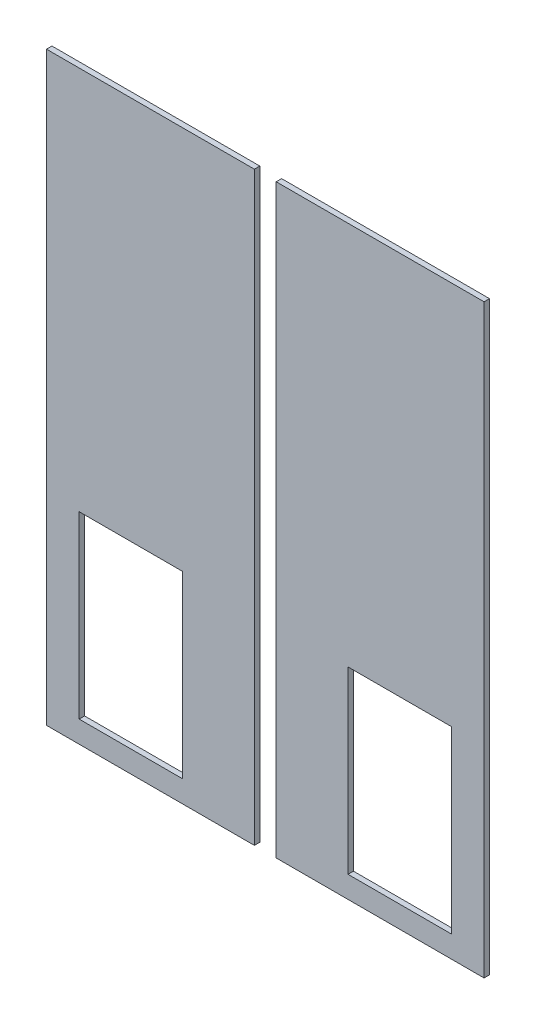
ISO-10303-21;
HEADER;
FILE_DESCRIPTION(('STEP AP214'),'2;1');
FILE_NAME('part.step','',(''),(''),'','','');
FILE_SCHEMA(('AUTOMOTIVE_DESIGN { 1 0 10303 214 1 1 1 1 }'));
ENDSEC;
DATA;
#1=APPLICATION_CONTEXT('core data for automotive mechanical design processes');
#2=APPLICATION_PROTOCOL_DEFINITION('international standard','automotive_design',2000,#1);
#3=PRODUCT_CONTEXT('',#1,'mechanical');
#4=PRODUCT('Part','Part','',(#3));
#5=PRODUCT_RELATED_PRODUCT_CATEGORY('part','',(#4));
#6=PRODUCT_DEFINITION_FORMATION('','',#4);
#7=PRODUCT_DEFINITION_CONTEXT('part definition',#1,'design');
#8=PRODUCT_DEFINITION('design','',#6,#7);
#9=PRODUCT_DEFINITION_SHAPE('','',#8);
#10=(LENGTH_UNIT() NAMED_UNIT(*) SI_UNIT(.MILLI.,.METRE.));
#11=(NAMED_UNIT(*) PLANE_ANGLE_UNIT() SI_UNIT($,.RADIAN.));
#12=(NAMED_UNIT(*) SI_UNIT($,.STERADIAN.) SOLID_ANGLE_UNIT());
#13=UNCERTAINTY_MEASURE_WITH_UNIT(LENGTH_MEASURE(1.E-05),#10,'distance_accuracy_value','');
#14=(GEOMETRIC_REPRESENTATION_CONTEXT(3) GLOBAL_UNCERTAINTY_ASSIGNED_CONTEXT((#13)) GLOBAL_UNIT_ASSIGNED_CONTEXT((#10,
#11,#12)) REPRESENTATION_CONTEXT('',''));
#15=CARTESIAN_POINT('',(0.,0.,0.));
#16=DIRECTION('',(0.,0.,1.));
#17=DIRECTION('',(1.,0.,0.));
#18=AXIS2_PLACEMENT_3D('',#15,#16,#17);
#19=CARTESIAN_POINT('',(0.,341.63,6.35));
#20=DIRECTION('',(0.,1.,0.));
#21=DIRECTION('',(0.,0.,1.));
#22=AXIS2_PLACEMENT_3D('',#19,#20,#21);
#23=PLANE('',#22);
#24=DIRECTION('',(1.,0.,0.));
#25=VECTOR('',#24,1.);
#26=CARTESIAN_POINT('',(0.,341.63,0.));
#27=LINE('',#26,#25);
#28=CARTESIAN_POINT('',(12.7,341.63,0.));
#29=VERTEX_POINT('',#28);
#30=CARTESIAN_POINT('',(255.27,341.63,0.));
#31=VERTEX_POINT('',#30);
#32=EDGE_CURVE('E172',#29,#31,#27,.T.);
#33=ORIENTED_EDGE('',*,*,#32,.F.);
#34=DIRECTION('',(0.,0.,-1.));
#35=VECTOR('',#34,1.);
#36=CARTESIAN_POINT('',(12.7,341.63,6.35));
#37=LINE('',#36,#35);
#38=CARTESIAN_POINT('',(12.7,341.63,6.35));
#39=VERTEX_POINT('',#38);
#40=EDGE_CURVE('E12',#39,#29,#37,.T.);
#41=ORIENTED_EDGE('',*,*,#40,.F.);
#42=DIRECTION('',(1.,0.,0.));
#43=VECTOR('',#42,1.);
#44=CARTESIAN_POINT('',(0.,341.63,6.35));
#45=LINE('',#44,#43);
#46=CARTESIAN_POINT('',(255.27,341.63,6.35));
#47=VERTEX_POINT('',#46);
#48=EDGE_CURVE('E142',#39,#47,#45,.T.);
#49=ORIENTED_EDGE('',*,*,#48,.T.);
#50=DIRECTION('',(0.,0.,-1.));
#51=VECTOR('',#50,1.);
#52=CARTESIAN_POINT('',(255.27,341.63,6.35));
#53=LINE('',#52,#51);
#54=EDGE_CURVE('E76',#47,#31,#53,.T.);
#55=ORIENTED_EDGE('',*,*,#54,.T.);
#56=EDGE_LOOP('',(#33,#41,#49,#55));
#57=FACE_BOUND('',#56,.T.);
#58=ADVANCED_FACE('F57',(#57),#23,.T.);
#59=CARTESIAN_POINT('',(12.7,0.,6.35));
#60=DIRECTION('',(1.,0.,0.));
#61=DIRECTION('',(0.,1.,0.));
#62=AXIS2_PLACEMENT_3D('',#59,#60,#61);
#63=PLANE('',#62);
#64=DIRECTION('',(0.,-1.,0.));
#65=VECTOR('',#64,1.);
#66=CARTESIAN_POINT('',(12.7,0.,0.));
#67=LINE('',#66,#65);
#68=CARTESIAN_POINT('',(12.7,-341.63,0.));
#69=VERTEX_POINT('',#68);
#70=EDGE_CURVE('E147',#29,#69,#67,.T.);
#71=ORIENTED_EDGE('',*,*,#70,.T.);
#72=DIRECTION('',(0.,0.,-1.));
#73=VECTOR('',#72,1.);
#74=CARTESIAN_POINT('',(12.7,-341.63,6.35));
#75=LINE('',#74,#73);
#76=CARTESIAN_POINT('',(12.7,-341.63,6.35));
#77=VERTEX_POINT('',#76);
#78=EDGE_CURVE('E67',#77,#69,#75,.T.);
#79=ORIENTED_EDGE('',*,*,#78,.F.);
#80=DIRECTION('',(0.,-1.,0.));
#81=VECTOR('',#80,1.);
#82=CARTESIAN_POINT('',(12.7,0.,6.35));
#83=LINE('',#82,#81);
#84=EDGE_CURVE('E137',#39,#77,#83,.T.);
#85=ORIENTED_EDGE('',*,*,#84,.F.);
#86=ORIENTED_EDGE('',*,*,#40,.T.);
#87=EDGE_LOOP('',(#71,#79,#85,#86));
#88=FACE_BOUND('',#87,.T.);
#89=ADVANCED_FACE('F145',(#88),#63,.F.);
#90=CARTESIAN_POINT('',(0.,-341.63,6.35));
#91=DIRECTION('',(0.,1.,0.));
#92=DIRECTION('',(0.,0.,1.));
#93=AXIS2_PLACEMENT_3D('',#90,#91,#92);
#94=PLANE('',#93);
#95=DIRECTION('',(1.,0.,0.));
#96=VECTOR('',#95,1.);
#97=CARTESIAN_POINT('',(0.,-341.63,0.));
#98=LINE('',#97,#96);
#99=CARTESIAN_POINT('',(255.27,-341.63,0.));
#100=VERTEX_POINT('',#99);
#101=EDGE_CURVE('E169',#69,#100,#98,.T.);
#102=ORIENTED_EDGE('',*,*,#101,.T.);
#103=DIRECTION('',(0.,0.,-1.));
#104=VECTOR('',#103,1.);
#105=CARTESIAN_POINT('',(255.27,-341.63,6.35));
#106=LINE('',#105,#104);
#107=CARTESIAN_POINT('',(255.27,-341.63,6.35));
#108=VERTEX_POINT('',#107);
#109=EDGE_CURVE('E102',#108,#100,#106,.T.);
#110=ORIENTED_EDGE('',*,*,#109,.F.);
#111=DIRECTION('',(1.,0.,0.));
#112=VECTOR('',#111,1.);
#113=CARTESIAN_POINT('',(0.,-341.63,6.35));
#114=LINE('',#113,#112);
#115=EDGE_CURVE('E129',#77,#108,#114,.T.);
#116=ORIENTED_EDGE('',*,*,#115,.F.);
#117=ORIENTED_EDGE('',*,*,#78,.T.);
#118=EDGE_LOOP('',(#102,#110,#116,#117));
#119=FACE_BOUND('',#118,.T.);
#120=ADVANCED_FACE('F131',(#119),#94,.F.);
#121=CARTESIAN_POINT('',(0.,-106.68,6.35));
#122=DIRECTION('',(0.,-1.,0.));
#123=DIRECTION('',(1.,0.,0.));
#124=AXIS2_PLACEMENT_3D('',#121,#122,#123);
#125=PLANE('',#124);
#126=DIRECTION('',(-1.,0.,0.));
#127=VECTOR('',#126,1.);
#128=CARTESIAN_POINT('',(0.,-106.68,0.));
#129=LINE('',#128,#127);
#130=CARTESIAN_POINT('',(217.17,-106.68,0.));
#131=VERTEX_POINT('',#130);
#132=CARTESIAN_POINT('',(96.52,-106.68,0.));
#133=VERTEX_POINT('',#132);
#134=EDGE_CURVE('E181',#131,#133,#129,.T.);
#135=ORIENTED_EDGE('',*,*,#134,.F.);
#136=DIRECTION('',(0.,0.,-1.));
#137=VECTOR('',#136,1.);
#138=CARTESIAN_POINT('',(217.17,-106.68,6.35));
#139=LINE('',#138,#137);
#140=CARTESIAN_POINT('',(217.17,-106.68,6.35));
#141=VERTEX_POINT('',#140);
#142=EDGE_CURVE('E61',#141,#131,#139,.T.);
#143=ORIENTED_EDGE('',*,*,#142,.F.);
#144=DIRECTION('',(-1.,0.,0.));
#145=VECTOR('',#144,1.);
#146=CARTESIAN_POINT('',(0.,-106.68,6.35));
#147=LINE('',#146,#145);
#148=CARTESIAN_POINT('',(96.52,-106.68,6.35));
#149=VERTEX_POINT('',#148);
#150=EDGE_CURVE('E168',#141,#149,#147,.T.);
#151=ORIENTED_EDGE('',*,*,#150,.T.);
#152=DIRECTION('',(0.,0.,-1.));
#153=VECTOR('',#152,1.);
#154=CARTESIAN_POINT('',(96.52,-106.68,6.35));
#155=LINE('',#154,#153);
#156=EDGE_CURVE('E152',#149,#133,#155,.T.);
#157=ORIENTED_EDGE('',*,*,#156,.T.);
#158=EDGE_LOOP('',(#135,#143,#151,#157));
#159=FACE_BOUND('',#158,.T.);
#160=ADVANCED_FACE('F59',(#159),#125,.T.);
#161=CARTESIAN_POINT('',(217.17,1.72589215646274E-13,6.35));
#162=DIRECTION('',(1.,0.,0.));
#163=DIRECTION('',(0.,1.,0.));
#164=AXIS2_PLACEMENT_3D('',#161,#162,#163);
#165=PLANE('',#164);
#166=DIRECTION('',(0.,-1.,0.));
#167=VECTOR('',#166,1.);
#168=CARTESIAN_POINT('',(217.17,1.72589215646274E-13,0.));
#169=LINE('',#168,#167);
#170=CARTESIAN_POINT('',(217.17,-316.23,0.));
#171=VERTEX_POINT('',#170);
#172=EDGE_CURVE('E179',#131,#171,#169,.T.);
#173=ORIENTED_EDGE('',*,*,#172,.T.);
#174=DIRECTION('',(0.,0.,-1.));
#175=VECTOR('',#174,1.);
#176=CARTESIAN_POINT('',(217.17,-316.23,6.35));
#177=LINE('',#176,#175);
#178=CARTESIAN_POINT('',(217.17,-316.23,6.35));
#179=VERTEX_POINT('',#178);
#180=EDGE_CURVE('E156',#179,#171,#177,.T.);
#181=ORIENTED_EDGE('',*,*,#180,.F.);
#182=DIRECTION('',(0.,-1.,0.));
#183=VECTOR('',#182,1.);
#184=CARTESIAN_POINT('',(217.17,1.72589215646274E-13,6.35));
#185=LINE('',#184,#183);
#186=EDGE_CURVE('E190',#141,#179,#185,.T.);
#187=ORIENTED_EDGE('',*,*,#186,.F.);
#188=ORIENTED_EDGE('',*,*,#142,.T.);
#189=EDGE_LOOP('',(#173,#181,#187,#188));
#190=FACE_BOUND('',#189,.T.);
#191=ADVANCED_FACE('F203',(#190),#165,.F.);
#192=CARTESIAN_POINT('',(-1.45497649016665E-13,-316.23,6.35));
#193=DIRECTION('',(0.,-1.,0.));
#194=DIRECTION('',(1.,0.,0.));
#195=AXIS2_PLACEMENT_3D('',#192,#193,#194);
#196=PLANE('',#195);
#197=DIRECTION('',(-1.,0.,0.));
#198=VECTOR('',#197,1.);
#199=CARTESIAN_POINT('',(-1.45497649016665E-13,-316.23,0.));
#200=LINE('',#199,#198);
#201=CARTESIAN_POINT('',(96.5200000000001,-316.23,0.));
#202=VERTEX_POINT('',#201);
#203=EDGE_CURVE('E177',#171,#202,#200,.T.);
#204=ORIENTED_EDGE('',*,*,#203,.T.);
#205=DIRECTION('',(0.,0.,-1.));
#206=VECTOR('',#205,1.);
#207=CARTESIAN_POINT('',(96.5200000000001,-316.23,6.35));
#208=LINE('',#207,#206);
#209=CARTESIAN_POINT('',(96.5200000000001,-316.23,6.35));
#210=VERTEX_POINT('',#209);
#211=EDGE_CURVE('E154',#210,#202,#208,.T.);
#212=ORIENTED_EDGE('',*,*,#211,.F.);
#213=DIRECTION('',(-1.,0.,0.));
#214=VECTOR('',#213,1.);
#215=CARTESIAN_POINT('',(-1.45497649016665E-13,-316.23,6.35));
#216=LINE('',#215,#214);
#217=EDGE_CURVE('E188',#179,#210,#216,.T.);
#218=ORIENTED_EDGE('',*,*,#217,.F.);
#219=ORIENTED_EDGE('',*,*,#180,.T.);
#220=EDGE_LOOP('',(#204,#212,#218,#219));
#221=FACE_BOUND('',#220,.T.);
#222=ADVANCED_FACE('F204',(#221),#196,.F.);
#223=CARTESIAN_POINT('',(96.52,0.,6.35));
#224=DIRECTION('',(-1.,0.,0.));
#225=DIRECTION('',(0.,-1.,0.));
#226=AXIS2_PLACEMENT_3D('',#223,#224,#225);
#227=PLANE('',#226);
#228=DIRECTION('',(0.,1.,0.));
#229=VECTOR('',#228,1.);
#230=CARTESIAN_POINT('',(96.52,0.,0.));
#231=LINE('',#230,#229);
#232=EDGE_CURVE('E174',#202,#133,#231,.T.);
#233=ORIENTED_EDGE('',*,*,#232,.T.);
#234=ORIENTED_EDGE('',*,*,#156,.F.);
#235=DIRECTION('',(0.,1.,0.));
#236=VECTOR('',#235,1.);
#237=CARTESIAN_POINT('',(96.52,0.,6.35));
#238=LINE('',#237,#236);
#239=EDGE_CURVE('E186',#210,#149,#238,.T.);
#240=ORIENTED_EDGE('',*,*,#239,.F.);
#241=ORIENTED_EDGE('',*,*,#211,.T.);
#242=EDGE_LOOP('',(#233,#234,#240,#241));
#243=FACE_BOUND('',#242,.T.);
#244=ADVANCED_FACE('F198',(#243),#227,.F.);
#245=CARTESIAN_POINT('',(255.27,0.,6.35));
#246=DIRECTION('',(1.,0.,0.));
#247=DIRECTION('',(0.,1.,0.));
#248=AXIS2_PLACEMENT_3D('',#245,#246,#247);
#249=PLANE('',#248);
#250=DIRECTION('',(0.,-1.,0.));
#251=VECTOR('',#250,1.);
#252=CARTESIAN_POINT('',(255.27,0.,0.));
#253=LINE('',#252,#251);
#254=EDGE_CURVE('E165',#31,#100,#253,.T.);
#255=ORIENTED_EDGE('',*,*,#254,.F.);
#256=ORIENTED_EDGE('',*,*,#54,.F.);
#257=DIRECTION('',(0.,-1.,0.));
#258=VECTOR('',#257,1.);
#259=CARTESIAN_POINT('',(255.27,0.,6.35));
#260=LINE('',#259,#258);
#261=EDGE_CURVE('E136',#47,#108,#260,.T.);
#262=ORIENTED_EDGE('',*,*,#261,.T.);
#263=ORIENTED_EDGE('',*,*,#109,.T.);
#264=EDGE_LOOP('',(#255,#256,#262,#263));
#265=FACE_BOUND('',#264,.T.);
#266=ADVANCED_FACE('F211',(#265),#249,.T.);
#267=CARTESIAN_POINT('',(0.,0.,6.35));
#268=DIRECTION('',(0.,0.,1.));
#269=DIRECTION('',(1.,0.,0.));
#270=AXIS2_PLACEMENT_3D('',#267,#268,#269);
#271=PLANE('',#270);
#272=ORIENTED_EDGE('',*,*,#150,.F.);
#273=ORIENTED_EDGE('',*,*,#186,.T.);
#274=ORIENTED_EDGE('',*,*,#217,.T.);
#275=ORIENTED_EDGE('',*,*,#239,.T.);
#276=EDGE_LOOP('',(#272,#273,#274,#275));
#277=FACE_BOUND('',#276,.T.);
#278=ORIENTED_EDGE('',*,*,#48,.F.);
#279=ORIENTED_EDGE('',*,*,#84,.T.);
#280=ORIENTED_EDGE('',*,*,#115,.T.);
#281=ORIENTED_EDGE('',*,*,#261,.F.);
#282=EDGE_LOOP('',(#278,#279,#280,#281));
#283=FACE_BOUND('',#282,.T.);
#284=ADVANCED_FACE('F141',(#277,#283),#271,.T.);
#285=CARTESIAN_POINT('',(0.,0.,0.));
#286=DIRECTION('',(0.,0.,1.));
#287=DIRECTION('',(1.,0.,0.));
#288=AXIS2_PLACEMENT_3D('',#285,#286,#287);
#289=PLANE('',#288);
#290=ORIENTED_EDGE('',*,*,#134,.T.);
#291=ORIENTED_EDGE('',*,*,#232,.F.);
#292=ORIENTED_EDGE('',*,*,#203,.F.);
#293=ORIENTED_EDGE('',*,*,#172,.F.);
#294=EDGE_LOOP('',(#290,#291,#292,#293));
#295=FACE_BOUND('',#294,.T.);
#296=ORIENTED_EDGE('',*,*,#32,.T.);
#297=ORIENTED_EDGE('',*,*,#254,.T.);
#298=ORIENTED_EDGE('',*,*,#101,.F.);
#299=ORIENTED_EDGE('',*,*,#70,.F.);
#300=EDGE_LOOP('',(#296,#297,#298,#299));
#301=FACE_BOUND('',#300,.T.);
#302=ADVANCED_FACE('F201',(#295,#301),#289,.F.);
#303=CLOSED_SHELL('',(#58,#89,#120,#160,#191,#222,#244,#266,#284,#302));
#304=MANIFOLD_SOLID_BREP('B2',#303);
#305=CARTESIAN_POINT('',(1.45497649016665E-13,-316.23,6.35));
#306=DIRECTION('',(0.,1.,0.));
#307=DIRECTION('',(-1.,0.,0.));
#308=AXIS2_PLACEMENT_3D('',#305,#306,#307);
#309=PLANE('',#308);
#310=DIRECTION('',(1.,0.,0.));
#311=VECTOR('',#310,1.);
#312=CARTESIAN_POINT('',(1.45497649016665E-13,-316.23,0.));
#313=LINE('',#312,#311);
#314=CARTESIAN_POINT('',(-217.17,-316.23,0.));
#315=VERTEX_POINT('',#314);
#316=CARTESIAN_POINT('',(-96.5199999999999,-316.23,0.));
#317=VERTEX_POINT('',#316);
#318=EDGE_CURVE('E406',#315,#317,#313,.T.);
#319=ORIENTED_EDGE('',*,*,#318,.F.);
#320=DIRECTION('',(0.,0.,-1.));
#321=VECTOR('',#320,1.);
#322=CARTESIAN_POINT('',(-217.17,-316.23,6.35));
#323=LINE('',#322,#321);
#324=CARTESIAN_POINT('',(-217.17,-316.23,6.35));
#325=VERTEX_POINT('',#324);
#326=EDGE_CURVE('E55',#325,#315,#323,.T.);
#327=ORIENTED_EDGE('',*,*,#326,.F.);
#328=DIRECTION('',(1.,0.,0.));
#329=VECTOR('',#328,1.);
#330=CARTESIAN_POINT('',(1.45497649016665E-13,-316.23,6.35));
#331=LINE('',#330,#329);
#332=CARTESIAN_POINT('',(-96.5199999999999,-316.23,6.35));
#333=VERTEX_POINT('',#332);
#334=EDGE_CURVE('E380',#325,#333,#331,.T.);
#335=ORIENTED_EDGE('',*,*,#334,.T.);
#336=DIRECTION('',(0.,0.,-1.));
#337=VECTOR('',#336,1.);
#338=CARTESIAN_POINT('',(-96.5199999999999,-316.23,6.35));
#339=LINE('',#338,#337);
#340=EDGE_CURVE('E307',#333,#317,#339,.T.);
#341=ORIENTED_EDGE('',*,*,#340,.T.);
#342=EDGE_LOOP('',(#319,#327,#335,#341));
#343=FACE_BOUND('',#342,.T.);
#344=ADVANCED_FACE('F287',(#343),#309,.T.);
#345=CARTESIAN_POINT('',(-217.17,1.15059477097516E-13,6.35));
#346=DIRECTION('',(1.,0.,0.));
#347=DIRECTION('',(0.,1.,0.));
#348=AXIS2_PLACEMENT_3D('',#345,#346,#347);
#349=PLANE('',#348);
#350=DIRECTION('',(0.,-1.,0.));
#351=VECTOR('',#350,1.);
#352=CARTESIAN_POINT('',(-217.17,1.15059477097516E-13,0.));
#353=LINE('',#352,#351);
#354=CARTESIAN_POINT('',(-217.17,-106.68,0.));
#355=VERTEX_POINT('',#354);
#356=EDGE_CURVE('E366',#355,#315,#353,.T.);
#357=ORIENTED_EDGE('',*,*,#356,.F.);
#358=DIRECTION('',(0.,0.,-1.));
#359=VECTOR('',#358,1.);
#360=CARTESIAN_POINT('',(-217.17,-106.68,6.35));
#361=LINE('',#360,#359);
#362=CARTESIAN_POINT('',(-217.17,-106.68,6.35));
#363=VERTEX_POINT('',#362);
#364=EDGE_CURVE('E298',#363,#355,#361,.T.);
#365=ORIENTED_EDGE('',*,*,#364,.F.);
#366=DIRECTION('',(0.,-1.,0.));
#367=VECTOR('',#366,1.);
#368=CARTESIAN_POINT('',(-217.17,1.15059477097516E-13,6.35));
#369=LINE('',#368,#367);
#370=EDGE_CURVE('E364',#363,#325,#369,.T.);
#371=ORIENTED_EDGE('',*,*,#370,.T.);
#372=ORIENTED_EDGE('',*,*,#326,.T.);
#373=EDGE_LOOP('',(#357,#365,#371,#372));
#374=FACE_BOUND('',#373,.T.);
#375=ADVANCED_FACE('F362',(#374),#349,.T.);
#376=CARTESIAN_POINT('',(0.,-106.68,6.35));
#377=DIRECTION('',(0.,1.,0.));
#378=DIRECTION('',(0.,0.,1.));
#379=AXIS2_PLACEMENT_3D('',#376,#377,#378);
#380=PLANE('',#379);
#381=DIRECTION('',(1.,0.,0.));
#382=VECTOR('',#381,1.);
#383=CARTESIAN_POINT('',(0.,-106.68,0.));
#384=LINE('',#383,#382);
#385=CARTESIAN_POINT('',(-96.5199999999999,-106.68,0.));
#386=VERTEX_POINT('',#385);
#387=EDGE_CURVE('E411',#355,#386,#384,.T.);
#388=ORIENTED_EDGE('',*,*,#387,.T.);
#389=DIRECTION('',(0.,0.,-1.));
#390=VECTOR('',#389,1.);
#391=CARTESIAN_POINT('',(-96.5199999999999,-106.68,6.35));
#392=LINE('',#391,#390);
#393=CARTESIAN_POINT('',(-96.5199999999999,-106.68,6.35));
#394=VERTEX_POINT('',#393);
#395=EDGE_CURVE('E333',#394,#386,#392,.T.);
#396=ORIENTED_EDGE('',*,*,#395,.F.);
#397=DIRECTION('',(1.,0.,0.));
#398=VECTOR('',#397,1.);
#399=CARTESIAN_POINT('',(0.,-106.68,6.35));
#400=LINE('',#399,#398);
#401=EDGE_CURVE('E371',#363,#394,#400,.T.);
#402=ORIENTED_EDGE('',*,*,#401,.F.);
#403=ORIENTED_EDGE('',*,*,#364,.T.);
#404=EDGE_LOOP('',(#388,#396,#402,#403));
#405=FACE_BOUND('',#404,.T.);
#406=ADVANCED_FACE('F372',(#405),#380,.F.);
#407=CARTESIAN_POINT('',(-12.7,0.,6.35));
#408=DIRECTION('',(1.,0.,0.));
#409=DIRECTION('',(0.,1.,0.));
#410=AXIS2_PLACEMENT_3D('',#407,#408,#409);
#411=PLANE('',#410);
#412=DIRECTION('',(0.,-1.,0.));
#413=VECTOR('',#412,1.);
#414=CARTESIAN_POINT('',(-12.7,0.,0.));
#415=LINE('',#414,#413);
#416=CARTESIAN_POINT('',(-12.7,341.63,0.));
#417=VERTEX_POINT('',#416);
#418=CARTESIAN_POINT('',(-12.7,-341.63,0.));
#419=VERTEX_POINT('',#418);
#420=EDGE_CURVE('E391',#417,#419,#415,.T.);
#421=ORIENTED_EDGE('',*,*,#420,.F.);
#422=DIRECTION('',(0.,0.,-1.));
#423=VECTOR('',#422,1.);
#424=CARTESIAN_POINT('',(-12.7,341.63,6.35));
#425=LINE('',#424,#423);
#426=CARTESIAN_POINT('',(-12.7,341.63,6.35));
#427=VERTEX_POINT('',#426);
#428=EDGE_CURVE('E291',#427,#417,#425,.T.);
#429=ORIENTED_EDGE('',*,*,#428,.F.);
#430=DIRECTION('',(0.,-1.,0.));
#431=VECTOR('',#430,1.);
#432=CARTESIAN_POINT('',(-12.7,0.,6.35));
#433=LINE('',#432,#431);
#434=CARTESIAN_POINT('',(-12.7,-341.63,6.35));
#435=VERTEX_POINT('',#434);
#436=EDGE_CURVE('E418',#427,#435,#433,.T.);
#437=ORIENTED_EDGE('',*,*,#436,.T.);
#438=DIRECTION('',(0.,0.,-1.));
#439=VECTOR('',#438,1.);
#440=CARTESIAN_POINT('',(-12.7,-341.63,6.35));
#441=LINE('',#440,#439);
#442=EDGE_CURVE('E390',#435,#419,#441,.T.);
#443=ORIENTED_EDGE('',*,*,#442,.T.);
#444=EDGE_LOOP('',(#421,#429,#437,#443));
#445=FACE_BOUND('',#444,.T.);
#446=ADVANCED_FACE('F289',(#445),#411,.T.);
#447=CARTESIAN_POINT('',(0.,341.63,6.35));
#448=DIRECTION('',(0.,1.,0.));
#449=DIRECTION('',(0.,0.,1.));
#450=AXIS2_PLACEMENT_3D('',#447,#448,#449);
#451=PLANE('',#450);
#452=DIRECTION('',(1.,0.,0.));
#453=VECTOR('',#452,1.);
#454=CARTESIAN_POINT('',(0.,341.63,0.));
#455=LINE('',#454,#453);
#456=CARTESIAN_POINT('',(-255.27,341.63,0.));
#457=VERTEX_POINT('',#456);
#458=EDGE_CURVE('E395',#457,#417,#455,.T.);
#459=ORIENTED_EDGE('',*,*,#458,.F.);
#460=DIRECTION('',(0.,0.,-1.));
#461=VECTOR('',#460,1.);
#462=CARTESIAN_POINT('',(-255.27,341.63,6.35));
#463=LINE('',#462,#461);
#464=CARTESIAN_POINT('',(-255.27,341.63,6.35));
#465=VERTEX_POINT('',#464);
#466=EDGE_CURVE('E428',#465,#457,#463,.T.);
#467=ORIENTED_EDGE('',*,*,#466,.F.);
#468=DIRECTION('',(1.,0.,0.));
#469=VECTOR('',#468,1.);
#470=CARTESIAN_POINT('',(0.,341.63,6.35));
#471=LINE('',#470,#469);
#472=EDGE_CURVE('E439',#465,#427,#471,.T.);
#473=ORIENTED_EDGE('',*,*,#472,.T.);
#474=ORIENTED_EDGE('',*,*,#428,.T.);
#475=EDGE_LOOP('',(#459,#467,#473,#474));
#476=FACE_BOUND('',#475,.T.);
#477=ADVANCED_FACE('F437',(#476),#451,.T.);
#478=CARTESIAN_POINT('',(-255.27,0.,6.35));
#479=DIRECTION('',(1.,0.,0.));
#480=DIRECTION('',(0.,1.,0.));
#481=AXIS2_PLACEMENT_3D('',#478,#479,#480);
#482=PLANE('',#481);
#483=DIRECTION('',(0.,-1.,0.));
#484=VECTOR('',#483,1.);
#485=CARTESIAN_POINT('',(-255.27,0.,0.));
#486=LINE('',#485,#484);
#487=CARTESIAN_POINT('',(-255.27,-341.63,0.));
#488=VERTEX_POINT('',#487);
#489=EDGE_CURVE('E399',#457,#488,#486,.T.);
#490=ORIENTED_EDGE('',*,*,#489,.T.);
#491=DIRECTION('',(0.,0.,-1.));
#492=VECTOR('',#491,1.);
#493=CARTESIAN_POINT('',(-255.27,-341.63,6.35));
#494=LINE('',#493,#492);
#495=CARTESIAN_POINT('',(-255.27,-341.63,6.35));
#496=VERTEX_POINT('',#495);
#497=EDGE_CURVE('E425',#496,#488,#494,.T.);
#498=ORIENTED_EDGE('',*,*,#497,.F.);
#499=DIRECTION('',(0.,-1.,0.));
#500=VECTOR('',#499,1.);
#501=CARTESIAN_POINT('',(-255.27,0.,6.35));
#502=LINE('',#501,#500);
#503=EDGE_CURVE('E452',#465,#496,#502,.T.);
#504=ORIENTED_EDGE('',*,*,#503,.F.);
#505=ORIENTED_EDGE('',*,*,#466,.T.);
#506=EDGE_LOOP('',(#490,#498,#504,#505));
#507=FACE_BOUND('',#506,.T.);
#508=ADVANCED_FACE('F446',(#507),#482,.F.);
#509=CARTESIAN_POINT('',(0.,-341.63,6.35));
#510=DIRECTION('',(0.,1.,0.));
#511=DIRECTION('',(0.,0.,1.));
#512=AXIS2_PLACEMENT_3D('',#509,#510,#511);
#513=PLANE('',#512);
#514=DIRECTION('',(1.,0.,0.));
#515=VECTOR('',#514,1.);
#516=CARTESIAN_POINT('',(0.,-341.63,0.));
#517=LINE('',#516,#515);
#518=EDGE_CURVE('E402',#488,#419,#517,.T.);
#519=ORIENTED_EDGE('',*,*,#518,.T.);
#520=ORIENTED_EDGE('',*,*,#442,.F.);
#521=DIRECTION('',(1.,0.,0.));
#522=VECTOR('',#521,1.);
#523=CARTESIAN_POINT('',(0.,-341.63,6.35));
#524=LINE('',#523,#522);
#525=EDGE_CURVE('E384',#496,#435,#524,.T.);
#526=ORIENTED_EDGE('',*,*,#525,.F.);
#527=ORIENTED_EDGE('',*,*,#497,.T.);
#528=EDGE_LOOP('',(#519,#520,#526,#527));
#529=FACE_BOUND('',#528,.T.);
#530=ADVANCED_FACE('F449',(#529),#513,.F.);
#531=CARTESIAN_POINT('',(-96.5199999999999,0.,6.35));
#532=DIRECTION('',(-1.,0.,0.));
#533=DIRECTION('',(0.,0.,1.));
#534=AXIS2_PLACEMENT_3D('',#531,#532,#533);
#535=PLANE('',#534);
#536=DIRECTION('',(0.,1.,0.));
#537=VECTOR('',#536,1.);
#538=CARTESIAN_POINT('',(-96.5199999999999,0.,0.));
#539=LINE('',#538,#537);
#540=EDGE_CURVE('E414',#317,#386,#539,.T.);
#541=ORIENTED_EDGE('',*,*,#540,.F.);
#542=ORIENTED_EDGE('',*,*,#340,.F.);
#543=DIRECTION('',(0.,1.,0.));
#544=VECTOR('',#543,1.);
#545=CARTESIAN_POINT('',(-96.5199999999999,0.,6.35));
#546=LINE('',#545,#544);
#547=EDGE_CURVE('E376',#333,#394,#546,.T.);
#548=ORIENTED_EDGE('',*,*,#547,.T.);
#549=ORIENTED_EDGE('',*,*,#395,.T.);
#550=EDGE_LOOP('',(#541,#542,#548,#549));
#551=FACE_BOUND('',#550,.T.);
#552=ADVANCED_FACE('F460',(#551),#535,.T.);
#553=CARTESIAN_POINT('',(0.,0.,6.35));
#554=DIRECTION('',(0.,0.,1.));
#555=DIRECTION('',(1.,0.,0.));
#556=AXIS2_PLACEMENT_3D('',#553,#554,#555);
#557=PLANE('',#556);
#558=ORIENTED_EDGE('',*,*,#436,.F.);
#559=ORIENTED_EDGE('',*,*,#472,.F.);
#560=ORIENTED_EDGE('',*,*,#503,.T.);
#561=ORIENTED_EDGE('',*,*,#525,.T.);
#562=EDGE_LOOP('',(#558,#559,#560,#561));
#563=FACE_BOUND('',#562,.T.);
#564=ORIENTED_EDGE('',*,*,#334,.F.);
#565=ORIENTED_EDGE('',*,*,#370,.F.);
#566=ORIENTED_EDGE('',*,*,#401,.T.);
#567=ORIENTED_EDGE('',*,*,#547,.F.);
#568=EDGE_LOOP('',(#564,#565,#566,#567));
#569=FACE_BOUND('',#568,.T.);
#570=ADVANCED_FACE('F379',(#563,#569),#557,.T.);
#571=CARTESIAN_POINT('',(0.,0.,0.));
#572=DIRECTION('',(0.,0.,1.));
#573=DIRECTION('',(1.,0.,0.));
#574=AXIS2_PLACEMENT_3D('',#571,#572,#573);
#575=PLANE('',#574);
#576=ORIENTED_EDGE('',*,*,#420,.T.);
#577=ORIENTED_EDGE('',*,*,#518,.F.);
#578=ORIENTED_EDGE('',*,*,#489,.F.);
#579=ORIENTED_EDGE('',*,*,#458,.T.);
#580=EDGE_LOOP('',(#576,#577,#578,#579));
#581=FACE_BOUND('',#580,.T.);
#582=ORIENTED_EDGE('',*,*,#318,.T.);
#583=ORIENTED_EDGE('',*,*,#540,.T.);
#584=ORIENTED_EDGE('',*,*,#387,.F.);
#585=ORIENTED_EDGE('',*,*,#356,.T.);
#586=EDGE_LOOP('',(#582,#583,#584,#585));
#587=FACE_BOUND('',#586,.T.);
#588=ADVANCED_FACE('F443',(#581,#587),#575,.F.);
#589=CLOSED_SHELL('',(#344,#375,#406,#446,#477,#508,#530,#552,#570,#588));
#590=MANIFOLD_SOLID_BREP('B6',#589);
#591=ADVANCED_BREP_SHAPE_REPRESENTATION('',(#18,#304,#590),#14);
#592=SHAPE_DEFINITION_REPRESENTATION(#9,#591);
ENDSEC;
END-ISO-10303-21;
